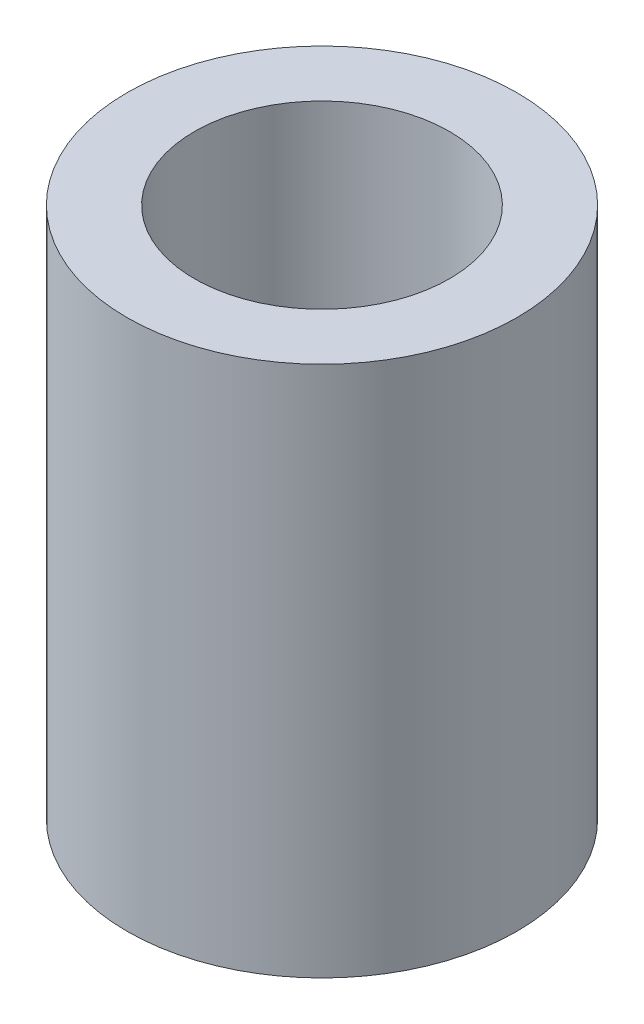
ISO-10303-21;
HEADER;
FILE_DESCRIPTION(('STEP AP214'),'2;1');
FILE_NAME('part.step','',(''),(''),'','','');
FILE_SCHEMA(('AUTOMOTIVE_DESIGN { 1 0 10303 214 1 1 1 1 }'));
ENDSEC;
DATA;
#1=APPLICATION_CONTEXT('core data for automotive mechanical design processes');
#2=APPLICATION_PROTOCOL_DEFINITION('international standard','automotive_design',2000,#1);
#3=PRODUCT_CONTEXT('',#1,'mechanical');
#4=PRODUCT('Part','Part','',(#3));
#5=PRODUCT_RELATED_PRODUCT_CATEGORY('part','',(#4));
#6=PRODUCT_DEFINITION_FORMATION('','',#4);
#7=PRODUCT_DEFINITION_CONTEXT('part definition',#1,'design');
#8=PRODUCT_DEFINITION('design','',#6,#7);
#9=PRODUCT_DEFINITION_SHAPE('','',#8);
#10=(LENGTH_UNIT() NAMED_UNIT(*) SI_UNIT(.MILLI.,.METRE.));
#11=(NAMED_UNIT(*) PLANE_ANGLE_UNIT() SI_UNIT($,.RADIAN.));
#12=(NAMED_UNIT(*) SI_UNIT($,.STERADIAN.) SOLID_ANGLE_UNIT());
#13=UNCERTAINTY_MEASURE_WITH_UNIT(LENGTH_MEASURE(1.E-05),#10,'distance_accuracy_value','');
#14=(GEOMETRIC_REPRESENTATION_CONTEXT(3) GLOBAL_UNCERTAINTY_ASSIGNED_CONTEXT((#13)) GLOBAL_UNIT_ASSIGNED_CONTEXT((#10,
#11,#12)) REPRESENTATION_CONTEXT('',''));
#15=CARTESIAN_POINT('',(0.,0.,0.));
#16=DIRECTION('',(0.,0.,1.));
#17=DIRECTION('',(1.,0.,0.));
#18=AXIS2_PLACEMENT_3D('',#15,#16,#17);
#19=CARTESIAN_POINT('',(0.,0.,0.));
#20=DIRECTION('',(0.,-1.,0.));
#21=DIRECTION('',(0.,0.,-1.));
#22=AXIS2_PLACEMENT_3D('',#19,#20,#21);
#23=CYLINDRICAL_SURFACE('',#22,14.4);
#24=CARTESIAN_POINT('',(0.,0.,0.));
#25=DIRECTION('',(0.,-1.,0.));
#26=DIRECTION('',(0.,0.,-1.));
#27=AXIS2_PLACEMENT_3D('',#24,#25,#26);
#28=CIRCLE('',#27,14.4);
#29=CARTESIAN_POINT('',(0.,0.,-14.4));
#30=VERTEX_POINT('',#29);
#31=EDGE_CURVE('E45',#30,#30,#28,.T.);
#32=ORIENTED_EDGE('',*,*,#31,.T.);
#33=EDGE_LOOP('',(#32));
#34=FACE_BOUND('',#33,.T.);
#35=CARTESIAN_POINT('',(0.,60.,0.));
#36=DIRECTION('',(0.,-1.,0.));
#37=DIRECTION('',(0.,0.,-1.));
#38=AXIS2_PLACEMENT_3D('',#35,#36,#37);
#39=CIRCLE('',#38,14.4);
#40=CARTESIAN_POINT('',(0.,60.,-14.4));
#41=VERTEX_POINT('',#40);
#42=EDGE_CURVE('E10',#41,#41,#39,.T.);
#43=ORIENTED_EDGE('',*,*,#42,.F.);
#44=EDGE_LOOP('',(#43));
#45=FACE_BOUND('',#44,.T.);
#46=ADVANCED_FACE('F31',(#34,#45),#23,.F.);
#47=CARTESIAN_POINT('',(14.4,60.,0.));
#48=DIRECTION('',(0.,1.,0.));
#49=DIRECTION('',(0.,0.,1.));
#50=AXIS2_PLACEMENT_3D('',#47,#48,#49);
#51=PLANE('',#50);
#52=ORIENTED_EDGE('',*,*,#42,.T.);
#53=EDGE_LOOP('',(#52));
#54=FACE_BOUND('',#53,.T.);
#55=CARTESIAN_POINT('',(0.,60.,0.));
#56=DIRECTION('',(0.,-1.,0.));
#57=DIRECTION('',(0.,0.,-1.));
#58=AXIS2_PLACEMENT_3D('',#55,#56,#57);
#59=CIRCLE('',#58,22.);
#60=CARTESIAN_POINT('',(0.,60.,-22.));
#61=VERTEX_POINT('',#60);
#62=EDGE_CURVE('E37',#61,#61,#59,.T.);
#63=ORIENTED_EDGE('',*,*,#62,.F.);
#64=EDGE_LOOP('',(#63));
#65=FACE_BOUND('',#64,.T.);
#66=ADVANCED_FACE('F61',(#54,#65),#51,.T.);
#67=CARTESIAN_POINT('',(0.,0.,0.));
#68=DIRECTION('',(0.,-1.,0.));
#69=DIRECTION('',(0.,0.,-1.));
#70=AXIS2_PLACEMENT_3D('',#67,#68,#69);
#71=CYLINDRICAL_SURFACE('',#70,22.);
#72=ORIENTED_EDGE('',*,*,#62,.T.);
#73=EDGE_LOOP('',(#72));
#74=FACE_BOUND('',#73,.T.);
#75=CARTESIAN_POINT('',(0.,0.,0.));
#76=DIRECTION('',(0.,-1.,0.));
#77=DIRECTION('',(0.,0.,-1.));
#78=AXIS2_PLACEMENT_3D('',#75,#76,#77);
#79=CIRCLE('',#78,22.);
#80=CARTESIAN_POINT('',(0.,0.,-22.));
#81=VERTEX_POINT('',#80);
#82=EDGE_CURVE('E41',#81,#81,#79,.T.);
#83=ORIENTED_EDGE('',*,*,#82,.F.);
#84=EDGE_LOOP('',(#83));
#85=FACE_BOUND('',#84,.T.);
#86=ADVANCED_FACE('F55',(#74,#85),#71,.T.);
#87=CARTESIAN_POINT('',(14.4,0.,0.));
#88=DIRECTION('',(0.,-1.,0.));
#89=DIRECTION('',(0.,0.,-1.));
#90=AXIS2_PLACEMENT_3D('',#87,#88,#89);
#91=PLANE('',#90);
#92=ORIENTED_EDGE('',*,*,#82,.T.);
#93=EDGE_LOOP('',(#92));
#94=FACE_BOUND('',#93,.T.);
#95=ORIENTED_EDGE('',*,*,#31,.F.);
#96=EDGE_LOOP('',(#95));
#97=FACE_BOUND('',#96,.T.);
#98=ADVANCED_FACE('F53',(#94,#97),#91,.T.);
#99=CLOSED_SHELL('',(#46,#66,#86,#98));
#100=MANIFOLD_SOLID_BREP('B2',#99);
#101=ADVANCED_BREP_SHAPE_REPRESENTATION('',(#18,#100),#14);
#102=SHAPE_DEFINITION_REPRESENTATION(#9,#101);
ENDSEC;
END-ISO-10303-21;
